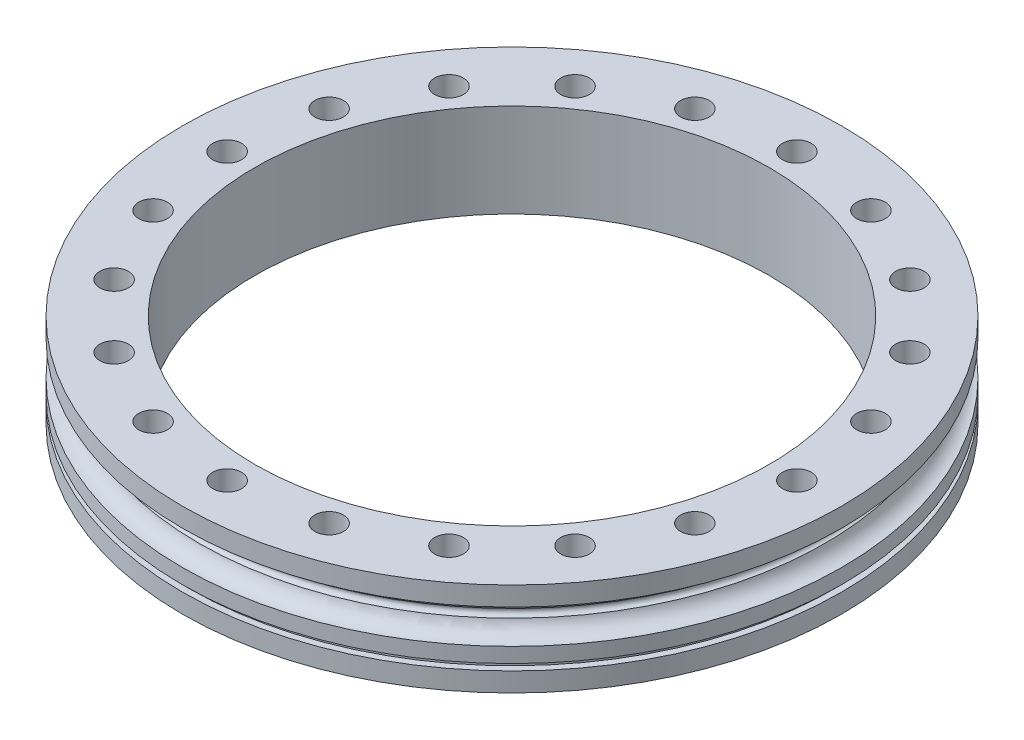
ISO-10303-21;
HEADER;
FILE_DESCRIPTION(('STEP AP214'),'2;1');
FILE_NAME('part.step','',(''),(''),'','','');
FILE_SCHEMA(('AUTOMOTIVE_DESIGN { 1 0 10303 214 1 1 1 1 }'));
ENDSEC;
DATA;
#1=APPLICATION_CONTEXT('core data for automotive mechanical design processes');
#2=APPLICATION_PROTOCOL_DEFINITION('international standard','automotive_design',2000,#1);
#3=PRODUCT_CONTEXT('',#1,'mechanical');
#4=PRODUCT('Part','Part','',(#3));
#5=PRODUCT_RELATED_PRODUCT_CATEGORY('part','',(#4));
#6=PRODUCT_DEFINITION_FORMATION('','',#4);
#7=PRODUCT_DEFINITION_CONTEXT('part definition',#1,'design');
#8=PRODUCT_DEFINITION('design','',#6,#7);
#9=PRODUCT_DEFINITION_SHAPE('','',#8);
#10=(LENGTH_UNIT() NAMED_UNIT(*) SI_UNIT(.MILLI.,.METRE.));
#11=(NAMED_UNIT(*) PLANE_ANGLE_UNIT() SI_UNIT($,.RADIAN.));
#12=(NAMED_UNIT(*) SI_UNIT($,.STERADIAN.) SOLID_ANGLE_UNIT());
#13=UNCERTAINTY_MEASURE_WITH_UNIT(LENGTH_MEASURE(1.E-05),#10,'distance_accuracy_value','');
#14=(GEOMETRIC_REPRESENTATION_CONTEXT(3) GLOBAL_UNCERTAINTY_ASSIGNED_CONTEXT((#13)) GLOBAL_UNIT_ASSIGNED_CONTEXT((#10,
#11,#12)) REPRESENTATION_CONTEXT('',''));
#15=CARTESIAN_POINT('',(0.,0.,0.));
#16=DIRECTION('',(0.,0.,1.));
#17=DIRECTION('',(1.,0.,0.));
#18=AXIS2_PLACEMENT_3D('',#15,#16,#17);
#19=CARTESIAN_POINT('',(0.,15.,0.));
#20=DIRECTION('',(0.,1.,0.));
#21=DIRECTION('',(0.,0.,1.));
#22=AXIS2_PLACEMENT_3D('',#19,#20,#21);
#23=TOROIDAL_SURFACE('',#22,155.,8.00000000000001);
#24=CARTESIAN_POINT('',(0.,16.9843134832984,0.));
#25=DIRECTION('',(0.,1.,0.));
#26=DIRECTION('',(0.,0.,1.));
#27=AXIS2_PLACEMENT_3D('',#24,#25,#26);
#28=CIRCLE('',#27,147.25);
#29=CARTESIAN_POINT('',(0.,16.9843134832984,147.25));
#30=VERTEX_POINT('',#29);
#31=EDGE_CURVE('E71',#30,#30,#28,.T.);
#32=ORIENTED_EDGE('',*,*,#31,.T.);
#33=EDGE_LOOP('',(#32));
#34=FACE_BOUND('',#33,.T.);
#35=CARTESIAN_POINT('',(0.,23.,0.));
#36=DIRECTION('',(0.,1.,0.));
#37=DIRECTION('',(0.,0.,1.));
#38=AXIS2_PLACEMENT_3D('',#35,#36,#37);
#39=CIRCLE('',#38,155.);
#40=CARTESIAN_POINT('',(0.,23.,155.));
#41=VERTEX_POINT('',#40);
#42=EDGE_CURVE('E10',#41,#41,#39,.T.);
#43=ORIENTED_EDGE('',*,*,#42,.F.);
#44=EDGE_LOOP('',(#43));
#45=FACE_BOUND('',#44,.T.);
#46=ADVANCED_FACE('F31',(#34,#45),#23,.F.);
#47=CARTESIAN_POINT('',(0.,44.,0.));
#48=DIRECTION('',(0.,1.,0.));
#49=DIRECTION('',(0.,0.,1.));
#50=AXIS2_PLACEMENT_3D('',#47,#48,#49);
#51=CYLINDRICAL_SURFACE('',#50,155.);
#52=ORIENTED_EDGE('',*,*,#42,.T.);
#53=EDGE_LOOP('',(#52));
#54=FACE_BOUND('',#53,.T.);
#55=CARTESIAN_POINT('',(0.,32.,0.));
#56=DIRECTION('',(0.,1.,0.));
#57=DIRECTION('',(0.,0.,1.));
#58=AXIS2_PLACEMENT_3D('',#55,#56,#57);
#59=CIRCLE('',#58,155.);
#60=CARTESIAN_POINT('',(0.,32.,155.));
#61=VERTEX_POINT('',#60);
#62=EDGE_CURVE('E37',#61,#61,#59,.T.);
#63=ORIENTED_EDGE('',*,*,#62,.F.);
#64=EDGE_LOOP('',(#63));
#65=FACE_BOUND('',#64,.T.);
#66=ADVANCED_FACE('F209',(#54,#65),#51,.T.);
#67=CARTESIAN_POINT('',(-155.,32.,0.));
#68=DIRECTION('',(0.,1.,0.));
#69=DIRECTION('',(0.,0.,1.));
#70=AXIS2_PLACEMENT_3D('',#67,#68,#69);
#71=PLANE('',#70);
#72=CARTESIAN_POINT('',(-127.441573183551,32.,41.408277246243));
#73=DIRECTION('',(0.,1.,0.));
#74=DIRECTION('',(0.,0.,1.));
#75=AXIS2_PLACEMENT_3D('',#72,#73,#74);
#76=CIRCLE('',#75,6.75000000000053);
#77=CARTESIAN_POINT('',(-127.441573183551,32.,48.1582772462435));
#78=VERTEX_POINT('',#77);
#79=EDGE_CURVE('E189',#78,#78,#76,.T.);
#80=ORIENTED_EDGE('',*,*,#79,.F.);
#81=EDGE_LOOP('',(#80));
#82=FACE_BOUND('',#81,.T.);
#83=CARTESIAN_POINT('',(-108.408277246244,32.,78.76322380719));
#84=DIRECTION('',(0.,1.,0.));
#85=DIRECTION('',(0.,0.,1.));
#86=AXIS2_PLACEMENT_3D('',#83,#84,#85);
#87=CIRCLE('',#86,6.75);
#88=CARTESIAN_POINT('',(-108.408277246244,32.,85.51322380719));
#89=VERTEX_POINT('',#88);
#90=EDGE_CURVE('E183',#89,#89,#87,.T.);
#91=ORIENTED_EDGE('',*,*,#90,.F.);
#92=EDGE_LOOP('',(#91));
#93=FACE_BOUND('',#92,.T.);
#94=CARTESIAN_POINT('',(-78.7632238071927,32.,108.408277246242));
#95=DIRECTION('',(0.,1.,0.));
#96=DIRECTION('',(0.,0.,1.));
#97=AXIS2_PLACEMENT_3D('',#94,#95,#96);
#98=CIRCLE('',#97,6.74999999999999);
#99=CARTESIAN_POINT('',(-78.7632238071927,32.,115.158277246242));
#100=VERTEX_POINT('',#99);
#101=EDGE_CURVE('E177',#100,#100,#98,.T.);
#102=ORIENTED_EDGE('',*,*,#101,.F.);
#103=EDGE_LOOP('',(#102));
#104=FACE_BOUND('',#103,.T.);
#105=CARTESIAN_POINT('',(-41.4082772462444,32.,127.44157318355));
#106=DIRECTION('',(0.,1.,0.));
#107=DIRECTION('',(0.,0.,1.));
#108=AXIS2_PLACEMENT_3D('',#105,#106,#107);
#109=CIRCLE('',#108,6.75);
#110=CARTESIAN_POINT('',(-41.4082772462444,32.,134.19157318355));
#111=VERTEX_POINT('',#110);
#112=EDGE_CURVE('E171',#111,#111,#109,.T.);
#113=ORIENTED_EDGE('',*,*,#112,.F.);
#114=EDGE_LOOP('',(#113));
#115=FACE_BOUND('',#114,.T.);
#116=CARTESIAN_POINT('',(-1.38716523110637E-12,32.,134.));
#117=DIRECTION('',(0.,1.,0.));
#118=DIRECTION('',(0.,0.,1.));
#119=AXIS2_PLACEMENT_3D('',#116,#117,#118);
#120=CIRCLE('',#119,6.75000000000001);
#121=CARTESIAN_POINT('',(-1.38716523110637E-12,32.,140.75));
#122=VERTEX_POINT('',#121);
#123=EDGE_CURVE('E165',#122,#122,#120,.T.);
#124=ORIENTED_EDGE('',*,*,#123,.F.);
#125=EDGE_LOOP('',(#124));
#126=FACE_BOUND('',#125,.T.);
#127=CARTESIAN_POINT('',(41.4082772462417,32.,127.441573183551));
#128=DIRECTION('',(0.,1.,0.));
#129=DIRECTION('',(0.,0.,1.));
#130=AXIS2_PLACEMENT_3D('',#127,#128,#129);
#131=CIRCLE('',#130,6.75000000000001);
#132=CARTESIAN_POINT('',(41.4082772462417,32.,134.191573183551));
#133=VERTEX_POINT('',#132);
#134=EDGE_CURVE('E159',#133,#133,#131,.T.);
#135=ORIENTED_EDGE('',*,*,#134,.F.);
#136=EDGE_LOOP('',(#135));
#137=FACE_BOUND('',#136,.T.);
#138=CARTESIAN_POINT('',(78.7632238071904,32.,108.408277246244));
#139=DIRECTION('',(0.,1.,0.));
#140=DIRECTION('',(0.,0.,1.));
#141=AXIS2_PLACEMENT_3D('',#138,#139,#140);
#142=CIRCLE('',#141,6.75);
#143=CARTESIAN_POINT('',(78.7632238071904,32.,115.158277246244));
#144=VERTEX_POINT('',#143);
#145=EDGE_CURVE('E153',#144,#144,#142,.T.);
#146=ORIENTED_EDGE('',*,*,#145,.F.);
#147=EDGE_LOOP('',(#146));
#148=FACE_BOUND('',#147,.T.);
#149=CARTESIAN_POINT('',(108.408277246242,32.,78.7632238071924));
#150=DIRECTION('',(0.,1.,0.));
#151=DIRECTION('',(0.,0.,1.));
#152=AXIS2_PLACEMENT_3D('',#149,#150,#151);
#153=CIRCLE('',#152,6.75);
#154=CARTESIAN_POINT('',(108.408277246242,32.,85.5132238071924));
#155=VERTEX_POINT('',#154);
#156=EDGE_CURVE('E147',#155,#155,#153,.T.);
#157=ORIENTED_EDGE('',*,*,#156,.F.);
#158=EDGE_LOOP('',(#157));
#159=FACE_BOUND('',#158,.T.);
#160=CARTESIAN_POINT('',(127.44157318355,32.,41.408277246244));
#161=DIRECTION('',(0.,1.,0.));
#162=DIRECTION('',(0.,0.,1.));
#163=AXIS2_PLACEMENT_3D('',#160,#161,#162);
#164=CIRCLE('',#163,6.74999999999999);
#165=CARTESIAN_POINT('',(127.44157318355,32.,48.1582772462439));
#166=VERTEX_POINT('',#165);
#167=EDGE_CURVE('E141',#166,#166,#164,.T.);
#168=ORIENTED_EDGE('',*,*,#167,.F.);
#169=EDGE_LOOP('',(#168));
#170=FACE_BOUND('',#169,.T.);
#171=CARTESIAN_POINT('',(134.,32.,9.19306731701385E-13));
#172=DIRECTION('',(0.,1.,0.));
#173=DIRECTION('',(0.,0.,1.));
#174=AXIS2_PLACEMENT_3D('',#171,#172,#173);
#175=CIRCLE('',#174,6.74999999999999);
#176=CARTESIAN_POINT('',(134.,32.,6.75000000000091));
#177=VERTEX_POINT('',#176);
#178=EDGE_CURVE('E135',#177,#177,#175,.T.);
#179=ORIENTED_EDGE('',*,*,#178,.F.);
#180=EDGE_LOOP('',(#179));
#181=FACE_BOUND('',#180,.T.);
#182=CARTESIAN_POINT('',(127.441573183551,32.,-41.4082772462421));
#183=DIRECTION('',(0.,1.,0.));
#184=DIRECTION('',(0.,0.,1.));
#185=AXIS2_PLACEMENT_3D('',#182,#183,#184);
#186=CIRCLE('',#185,6.75);
#187=CARTESIAN_POINT('',(127.441573183551,32.,-34.6582772462421));
#188=VERTEX_POINT('',#187);
#189=EDGE_CURVE('E129',#188,#188,#186,.T.);
#190=ORIENTED_EDGE('',*,*,#189,.F.);
#191=EDGE_LOOP('',(#190));
#192=FACE_BOUND('',#191,.T.);
#193=CARTESIAN_POINT('',(108.408277246243,32.,-78.7632238071908));
#194=DIRECTION('',(0.,1.,0.));
#195=DIRECTION('',(0.,0.,1.));
#196=AXIS2_PLACEMENT_3D('',#193,#194,#195);
#197=CIRCLE('',#196,6.75);
#198=CARTESIAN_POINT('',(108.408277246243,32.,-72.0132238071908));
#199=VERTEX_POINT('',#198);
#200=EDGE_CURVE('E123',#199,#199,#197,.T.);
#201=ORIENTED_EDGE('',*,*,#200,.F.);
#202=EDGE_LOOP('',(#201));
#203=FACE_BOUND('',#202,.T.);
#204=CARTESIAN_POINT('',(78.7632238071919,32.,-108.408277246243));
#205=DIRECTION('',(0.,1.,0.));
#206=DIRECTION('',(0.,0.,1.));
#207=AXIS2_PLACEMENT_3D('',#204,#205,#206);
#208=CIRCLE('',#207,6.75000000000002);
#209=CARTESIAN_POINT('',(78.7632238071919,32.,-101.658277246243));
#210=VERTEX_POINT('',#209);
#211=EDGE_CURVE('E117',#210,#210,#208,.T.);
#212=ORIENTED_EDGE('',*,*,#211,.F.);
#213=EDGE_LOOP('',(#212));
#214=FACE_BOUND('',#213,.T.);
#215=CARTESIAN_POINT('',(41.4082772462435,32.,-127.44157318355));
#216=DIRECTION('',(0.,1.,0.));
#217=DIRECTION('',(0.,0.,1.));
#218=AXIS2_PLACEMENT_3D('',#215,#216,#217);
#219=CIRCLE('',#218,6.74999999999999);
#220=CARTESIAN_POINT('',(41.4082772462435,32.,-120.69157318355));
#221=VERTEX_POINT('',#220);
#222=EDGE_CURVE('E111',#221,#221,#219,.T.);
#223=ORIENTED_EDGE('',*,*,#222,.F.);
#224=EDGE_LOOP('',(#223));
#225=FACE_BOUND('',#224,.T.);
#226=CARTESIAN_POINT('',(4.51448232296405E-13,32.,-134.));
#227=DIRECTION('',(0.,1.,0.));
#228=DIRECTION('',(0.,0.,1.));
#229=AXIS2_PLACEMENT_3D('',#226,#227,#228);
#230=CIRCLE('',#229,6.74999999999999);
#231=CARTESIAN_POINT('',(4.51448232296405E-13,32.,-127.25));
#232=VERTEX_POINT('',#231);
#233=EDGE_CURVE('E105',#232,#232,#230,.T.);
#234=ORIENTED_EDGE('',*,*,#233,.F.);
#235=EDGE_LOOP('',(#234));
#236=FACE_BOUND('',#235,.T.);
#237=CARTESIAN_POINT('',(-41.4082772462426,32.,-127.441573183551));
#238=DIRECTION('',(0.,1.,0.));
#239=DIRECTION('',(0.,0.,1.));
#240=AXIS2_PLACEMENT_3D('',#237,#238,#239);
#241=CIRCLE('',#240,6.75000000000003);
#242=CARTESIAN_POINT('',(-41.4082772462426,32.,-120.691573183551));
#243=VERTEX_POINT('',#242);
#244=EDGE_CURVE('E99',#243,#243,#241,.T.);
#245=ORIENTED_EDGE('',*,*,#244,.F.);
#246=EDGE_LOOP('',(#245));
#247=FACE_BOUND('',#246,.T.);
#248=CARTESIAN_POINT('',(-78.7632238071912,32.,-108.408277246243));
#249=DIRECTION('',(0.,1.,0.));
#250=DIRECTION('',(0.,0.,1.));
#251=AXIS2_PLACEMENT_3D('',#248,#249,#250);
#252=CIRCLE('',#251,6.75);
#253=CARTESIAN_POINT('',(-78.7632238071912,32.,-101.658277246243));
#254=VERTEX_POINT('',#253);
#255=EDGE_CURVE('E93',#254,#254,#252,.T.);
#256=ORIENTED_EDGE('',*,*,#255,.F.);
#257=EDGE_LOOP('',(#256));
#258=FACE_BOUND('',#257,.T.);
#259=CARTESIAN_POINT('',(-108.408277246243,32.,-78.7632238071915));
#260=DIRECTION('',(0.,1.,0.));
#261=DIRECTION('',(0.,0.,1.));
#262=AXIS2_PLACEMENT_3D('',#259,#260,#261);
#263=CIRCLE('',#262,6.75);
#264=CARTESIAN_POINT('',(-108.408277246243,32.,-72.0132238071916));
#265=VERTEX_POINT('',#264);
#266=EDGE_CURVE('E87',#265,#265,#263,.T.);
#267=ORIENTED_EDGE('',*,*,#266,.F.);
#268=EDGE_LOOP('',(#267));
#269=FACE_BOUND('',#268,.T.);
#270=CARTESIAN_POINT('',(-127.441573183551,32.,-41.4082772462429));
#271=DIRECTION('',(0.,1.,0.));
#272=DIRECTION('',(0.,0.,1.));
#273=AXIS2_PLACEMENT_3D('',#270,#271,#272);
#274=CIRCLE('',#273,6.75000000000001);
#275=CARTESIAN_POINT('',(-127.441573183551,32.,-34.6582772462429));
#276=VERTEX_POINT('',#275);
#277=EDGE_CURVE('E81',#276,#276,#274,.T.);
#278=ORIENTED_EDGE('',*,*,#277,.F.);
#279=EDGE_LOOP('',(#278));
#280=FACE_BOUND('',#279,.T.);
#281=CARTESIAN_POINT('',(-134.,32.,0.));
#282=DIRECTION('',(0.,1.,0.));
#283=DIRECTION('',(0.,0.,1.));
#284=AXIS2_PLACEMENT_3D('',#281,#282,#283);
#285=CIRCLE('',#284,6.75);
#286=CARTESIAN_POINT('',(-134.,32.,6.75000000000002));
#287=VERTEX_POINT('',#286);
#288=EDGE_CURVE('E75',#287,#287,#285,.T.);
#289=ORIENTED_EDGE('',*,*,#288,.F.);
#290=EDGE_LOOP('',(#289));
#291=FACE_BOUND('',#290,.T.);
#292=ORIENTED_EDGE('',*,*,#62,.T.);
#293=EDGE_LOOP('',(#292));
#294=FACE_BOUND('',#293,.T.);
#295=CARTESIAN_POINT('',(0.,32.,0.));
#296=DIRECTION('',(0.,1.,0.));
#297=DIRECTION('',(0.,0.,1.));
#298=AXIS2_PLACEMENT_3D('',#295,#296,#297);
#299=CIRCLE('',#298,121.);
#300=CARTESIAN_POINT('',(0.,32.,121.));
#301=VERTEX_POINT('',#300);
#302=EDGE_CURVE('E41',#301,#301,#299,.T.);
#303=ORIENTED_EDGE('',*,*,#302,.F.);
#304=EDGE_LOOP('',(#303));
#305=FACE_BOUND('',#304,.T.);
#306=ADVANCED_FACE('F205',(#82,#93,#104,#115,#126,#137,#148,#159,#170,#181,#192,#203,#214,#225,
#236,#247,#258,#269,#280,#291,#294,#305),#71,.T.);
#307=CARTESIAN_POINT('',(0.,44.,0.));
#308=DIRECTION('',(0.,1.,0.));
#309=DIRECTION('',(0.,0.,1.));
#310=AXIS2_PLACEMENT_3D('',#307,#308,#309);
#311=CYLINDRICAL_SURFACE('',#310,121.);
#312=ORIENTED_EDGE('',*,*,#302,.T.);
#313=EDGE_LOOP('',(#312));
#314=FACE_BOUND('',#313,.T.);
#315=CARTESIAN_POINT('',(0.,-12.,0.));
#316=DIRECTION('',(0.,1.,0.));
#317=DIRECTION('',(0.,0.,1.));
#318=AXIS2_PLACEMENT_3D('',#315,#316,#317);
#319=CIRCLE('',#318,121.);
#320=CARTESIAN_POINT('',(0.,-12.,121.));
#321=VERTEX_POINT('',#320);
#322=EDGE_CURVE('E45',#321,#321,#319,.T.);
#323=ORIENTED_EDGE('',*,*,#322,.F.);
#324=EDGE_LOOP('',(#323));
#325=FACE_BOUND('',#324,.T.);
#326=ADVANCED_FACE('F208',(#314,#325),#311,.F.);
#327=CARTESIAN_POINT('',(-121.,-12.,0.));
#328=DIRECTION('',(0.,-1.,0.));
#329=DIRECTION('',(0.,0.,-1.));
#330=AXIS2_PLACEMENT_3D('',#327,#328,#329);
#331=PLANE('',#330);
#332=CARTESIAN_POINT('',(-127.441573183551,-12.,41.408277246243));
#333=DIRECTION('',(0.,1.,0.));
#334=DIRECTION('',(0.,0.,1.));
#335=AXIS2_PLACEMENT_3D('',#332,#333,#334);
#336=CIRCLE('',#335,6.75000000000053);
#337=CARTESIAN_POINT('',(-127.441573183551,-12.,48.1582772462435));
#338=VERTEX_POINT('',#337);
#339=EDGE_CURVE('E186',#338,#338,#336,.T.);
#340=ORIENTED_EDGE('',*,*,#339,.T.);
#341=EDGE_LOOP('',(#340));
#342=FACE_BOUND('',#341,.T.);
#343=CARTESIAN_POINT('',(-108.408277246244,-12.,78.76322380719));
#344=DIRECTION('',(0.,1.,0.));
#345=DIRECTION('',(0.,0.,1.));
#346=AXIS2_PLACEMENT_3D('',#343,#344,#345);
#347=CIRCLE('',#346,6.75);
#348=CARTESIAN_POINT('',(-108.408277246244,-12.,85.51322380719));
#349=VERTEX_POINT('',#348);
#350=EDGE_CURVE('E180',#349,#349,#347,.T.);
#351=ORIENTED_EDGE('',*,*,#350,.T.);
#352=EDGE_LOOP('',(#351));
#353=FACE_BOUND('',#352,.T.);
#354=CARTESIAN_POINT('',(-78.7632238071927,-12.,108.408277246242));
#355=DIRECTION('',(0.,1.,0.));
#356=DIRECTION('',(0.,0.,1.));
#357=AXIS2_PLACEMENT_3D('',#354,#355,#356);
#358=CIRCLE('',#357,6.74999999999999);
#359=CARTESIAN_POINT('',(-78.7632238071927,-12.,115.158277246242));
#360=VERTEX_POINT('',#359);
#361=EDGE_CURVE('E174',#360,#360,#358,.T.);
#362=ORIENTED_EDGE('',*,*,#361,.T.);
#363=EDGE_LOOP('',(#362));
#364=FACE_BOUND('',#363,.T.);
#365=CARTESIAN_POINT('',(-41.4082772462444,-12.,127.44157318355));
#366=DIRECTION('',(0.,1.,0.));
#367=DIRECTION('',(0.,0.,1.));
#368=AXIS2_PLACEMENT_3D('',#365,#366,#367);
#369=CIRCLE('',#368,6.75);
#370=CARTESIAN_POINT('',(-41.4082772462444,-12.,134.19157318355));
#371=VERTEX_POINT('',#370);
#372=EDGE_CURVE('E168',#371,#371,#369,.T.);
#373=ORIENTED_EDGE('',*,*,#372,.T.);
#374=EDGE_LOOP('',(#373));
#375=FACE_BOUND('',#374,.T.);
#376=CARTESIAN_POINT('',(-1.38716523110637E-12,-12.,134.));
#377=DIRECTION('',(0.,1.,0.));
#378=DIRECTION('',(0.,0.,1.));
#379=AXIS2_PLACEMENT_3D('',#376,#377,#378);
#380=CIRCLE('',#379,6.75000000000001);
#381=CARTESIAN_POINT('',(-1.38716523110637E-12,-12.,140.75));
#382=VERTEX_POINT('',#381);
#383=EDGE_CURVE('E162',#382,#382,#380,.T.);
#384=ORIENTED_EDGE('',*,*,#383,.T.);
#385=EDGE_LOOP('',(#384));
#386=FACE_BOUND('',#385,.T.);
#387=CARTESIAN_POINT('',(41.4082772462417,-12.,127.441573183551));
#388=DIRECTION('',(0.,1.,0.));
#389=DIRECTION('',(0.,0.,1.));
#390=AXIS2_PLACEMENT_3D('',#387,#388,#389);
#391=CIRCLE('',#390,6.75000000000001);
#392=CARTESIAN_POINT('',(41.4082772462417,-12.,134.191573183551));
#393=VERTEX_POINT('',#392);
#394=EDGE_CURVE('E156',#393,#393,#391,.T.);
#395=ORIENTED_EDGE('',*,*,#394,.T.);
#396=EDGE_LOOP('',(#395));
#397=FACE_BOUND('',#396,.T.);
#398=CARTESIAN_POINT('',(78.7632238071904,-12.,108.408277246244));
#399=DIRECTION('',(0.,1.,0.));
#400=DIRECTION('',(0.,0.,1.));
#401=AXIS2_PLACEMENT_3D('',#398,#399,#400);
#402=CIRCLE('',#401,6.75);
#403=CARTESIAN_POINT('',(78.7632238071904,-12.,115.158277246244));
#404=VERTEX_POINT('',#403);
#405=EDGE_CURVE('E150',#404,#404,#402,.T.);
#406=ORIENTED_EDGE('',*,*,#405,.T.);
#407=EDGE_LOOP('',(#406));
#408=FACE_BOUND('',#407,.T.);
#409=CARTESIAN_POINT('',(108.408277246242,-12.,78.7632238071924));
#410=DIRECTION('',(0.,1.,0.));
#411=DIRECTION('',(0.,0.,1.));
#412=AXIS2_PLACEMENT_3D('',#409,#410,#411);
#413=CIRCLE('',#412,6.75);
#414=CARTESIAN_POINT('',(108.408277246242,-12.,85.5132238071924));
#415=VERTEX_POINT('',#414);
#416=EDGE_CURVE('E144',#415,#415,#413,.T.);
#417=ORIENTED_EDGE('',*,*,#416,.T.);
#418=EDGE_LOOP('',(#417));
#419=FACE_BOUND('',#418,.T.);
#420=CARTESIAN_POINT('',(127.44157318355,-12.,41.408277246244));
#421=DIRECTION('',(0.,1.,0.));
#422=DIRECTION('',(0.,0.,1.));
#423=AXIS2_PLACEMENT_3D('',#420,#421,#422);
#424=CIRCLE('',#423,6.74999999999999);
#425=CARTESIAN_POINT('',(127.44157318355,-12.,48.1582772462439));
#426=VERTEX_POINT('',#425);
#427=EDGE_CURVE('E138',#426,#426,#424,.T.);
#428=ORIENTED_EDGE('',*,*,#427,.T.);
#429=EDGE_LOOP('',(#428));
#430=FACE_BOUND('',#429,.T.);
#431=CARTESIAN_POINT('',(134.,-12.,9.19306731701385E-13));
#432=DIRECTION('',(0.,1.,0.));
#433=DIRECTION('',(0.,0.,1.));
#434=AXIS2_PLACEMENT_3D('',#431,#432,#433);
#435=CIRCLE('',#434,6.74999999999999);
#436=CARTESIAN_POINT('',(134.,-12.,6.75000000000091));
#437=VERTEX_POINT('',#436);
#438=EDGE_CURVE('E132',#437,#437,#435,.T.);
#439=ORIENTED_EDGE('',*,*,#438,.T.);
#440=EDGE_LOOP('',(#439));
#441=FACE_BOUND('',#440,.T.);
#442=CARTESIAN_POINT('',(127.441573183551,-12.,-41.4082772462421));
#443=DIRECTION('',(0.,1.,0.));
#444=DIRECTION('',(0.,0.,1.));
#445=AXIS2_PLACEMENT_3D('',#442,#443,#444);
#446=CIRCLE('',#445,6.75);
#447=CARTESIAN_POINT('',(127.441573183551,-12.,-34.6582772462421));
#448=VERTEX_POINT('',#447);
#449=EDGE_CURVE('E126',#448,#448,#446,.T.);
#450=ORIENTED_EDGE('',*,*,#449,.T.);
#451=EDGE_LOOP('',(#450));
#452=FACE_BOUND('',#451,.T.);
#453=CARTESIAN_POINT('',(108.408277246243,-12.,-78.7632238071908));
#454=DIRECTION('',(0.,1.,0.));
#455=DIRECTION('',(0.,0.,1.));
#456=AXIS2_PLACEMENT_3D('',#453,#454,#455);
#457=CIRCLE('',#456,6.75);
#458=CARTESIAN_POINT('',(108.408277246243,-12.,-72.0132238071908));
#459=VERTEX_POINT('',#458);
#460=EDGE_CURVE('E120',#459,#459,#457,.T.);
#461=ORIENTED_EDGE('',*,*,#460,.T.);
#462=EDGE_LOOP('',(#461));
#463=FACE_BOUND('',#462,.T.);
#464=CARTESIAN_POINT('',(78.7632238071919,-12.,-108.408277246243));
#465=DIRECTION('',(0.,1.,0.));
#466=DIRECTION('',(0.,0.,1.));
#467=AXIS2_PLACEMENT_3D('',#464,#465,#466);
#468=CIRCLE('',#467,6.75000000000002);
#469=CARTESIAN_POINT('',(78.7632238071919,-12.,-101.658277246243));
#470=VERTEX_POINT('',#469);
#471=EDGE_CURVE('E114',#470,#470,#468,.T.);
#472=ORIENTED_EDGE('',*,*,#471,.T.);
#473=EDGE_LOOP('',(#472));
#474=FACE_BOUND('',#473,.T.);
#475=CARTESIAN_POINT('',(41.4082772462435,-12.,-127.44157318355));
#476=DIRECTION('',(0.,1.,0.));
#477=DIRECTION('',(0.,0.,1.));
#478=AXIS2_PLACEMENT_3D('',#475,#476,#477);
#479=CIRCLE('',#478,6.74999999999999);
#480=CARTESIAN_POINT('',(41.4082772462435,-12.,-120.69157318355));
#481=VERTEX_POINT('',#480);
#482=EDGE_CURVE('E108',#481,#481,#479,.T.);
#483=ORIENTED_EDGE('',*,*,#482,.T.);
#484=EDGE_LOOP('',(#483));
#485=FACE_BOUND('',#484,.T.);
#486=CARTESIAN_POINT('',(4.51448232296405E-13,-12.,-134.));
#487=DIRECTION('',(0.,1.,0.));
#488=DIRECTION('',(0.,0.,1.));
#489=AXIS2_PLACEMENT_3D('',#486,#487,#488);
#490=CIRCLE('',#489,6.74999999999999);
#491=CARTESIAN_POINT('',(4.51448232296405E-13,-12.,-127.25));
#492=VERTEX_POINT('',#491);
#493=EDGE_CURVE('E102',#492,#492,#490,.T.);
#494=ORIENTED_EDGE('',*,*,#493,.T.);
#495=EDGE_LOOP('',(#494));
#496=FACE_BOUND('',#495,.T.);
#497=CARTESIAN_POINT('',(-41.4082772462426,-12.,-127.441573183551));
#498=DIRECTION('',(0.,1.,0.));
#499=DIRECTION('',(0.,0.,1.));
#500=AXIS2_PLACEMENT_3D('',#497,#498,#499);
#501=CIRCLE('',#500,6.75000000000003);
#502=CARTESIAN_POINT('',(-41.4082772462426,-12.,-120.691573183551));
#503=VERTEX_POINT('',#502);
#504=EDGE_CURVE('E96',#503,#503,#501,.T.);
#505=ORIENTED_EDGE('',*,*,#504,.T.);
#506=EDGE_LOOP('',(#505));
#507=FACE_BOUND('',#506,.T.);
#508=CARTESIAN_POINT('',(-78.7632238071912,-12.,-108.408277246243));
#509=DIRECTION('',(0.,1.,0.));
#510=DIRECTION('',(0.,0.,1.));
#511=AXIS2_PLACEMENT_3D('',#508,#509,#510);
#512=CIRCLE('',#511,6.75);
#513=CARTESIAN_POINT('',(-78.7632238071912,-12.,-101.658277246243));
#514=VERTEX_POINT('',#513);
#515=EDGE_CURVE('E90',#514,#514,#512,.T.);
#516=ORIENTED_EDGE('',*,*,#515,.T.);
#517=EDGE_LOOP('',(#516));
#518=FACE_BOUND('',#517,.T.);
#519=CARTESIAN_POINT('',(-108.408277246243,-12.,-78.7632238071915));
#520=DIRECTION('',(0.,1.,0.));
#521=DIRECTION('',(0.,0.,1.));
#522=AXIS2_PLACEMENT_3D('',#519,#520,#521);
#523=CIRCLE('',#522,6.75);
#524=CARTESIAN_POINT('',(-108.408277246243,-12.,-72.0132238071916));
#525=VERTEX_POINT('',#524);
#526=EDGE_CURVE('E84',#525,#525,#523,.T.);
#527=ORIENTED_EDGE('',*,*,#526,.T.);
#528=EDGE_LOOP('',(#527));
#529=FACE_BOUND('',#528,.T.);
#530=CARTESIAN_POINT('',(-127.441573183551,-12.,-41.4082772462429));
#531=DIRECTION('',(0.,1.,0.));
#532=DIRECTION('',(0.,0.,1.));
#533=AXIS2_PLACEMENT_3D('',#530,#531,#532);
#534=CIRCLE('',#533,6.75000000000001);
#535=CARTESIAN_POINT('',(-127.441573183551,-12.,-34.6582772462429));
#536=VERTEX_POINT('',#535);
#537=EDGE_CURVE('E78',#536,#536,#534,.T.);
#538=ORIENTED_EDGE('',*,*,#537,.T.);
#539=EDGE_LOOP('',(#538));
#540=FACE_BOUND('',#539,.T.);
#541=CARTESIAN_POINT('',(-134.,-12.,0.));
#542=DIRECTION('',(0.,1.,0.));
#543=DIRECTION('',(0.,0.,1.));
#544=AXIS2_PLACEMENT_3D('',#541,#542,#543);
#545=CIRCLE('',#544,6.75);
#546=CARTESIAN_POINT('',(-134.,-12.,6.75000000000002));
#547=VERTEX_POINT('',#546);
#548=EDGE_CURVE('E74',#547,#547,#545,.T.);
#549=ORIENTED_EDGE('',*,*,#548,.T.);
#550=EDGE_LOOP('',(#549));
#551=FACE_BOUND('',#550,.T.);
#552=ORIENTED_EDGE('',*,*,#322,.T.);
#553=EDGE_LOOP('',(#552));
#554=FACE_BOUND('',#553,.T.);
#555=CARTESIAN_POINT('',(0.,-12.,0.));
#556=DIRECTION('',(0.,1.,0.));
#557=DIRECTION('',(0.,0.,1.));
#558=AXIS2_PLACEMENT_3D('',#555,#556,#557);
#559=CIRCLE('',#558,155.);
#560=CARTESIAN_POINT('',(0.,-12.,155.));
#561=VERTEX_POINT('',#560);
#562=EDGE_CURVE('E50',#561,#561,#559,.T.);
#563=ORIENTED_EDGE('',*,*,#562,.F.);
#564=EDGE_LOOP('',(#563));
#565=FACE_BOUND('',#564,.T.);
#566=ADVANCED_FACE('F195',(#342,#353,#364,#375,#386,#397,#408,#419,#430,#441,#452,#463,#474,
#485,#496,#507,#518,#529,#540,#551,#554,#565),#331,.T.);
#567=CARTESIAN_POINT('',(0.,44.,0.));
#568=DIRECTION('',(0.,1.,0.));
#569=DIRECTION('',(0.,0.,1.));
#570=AXIS2_PLACEMENT_3D('',#567,#568,#569);
#571=CYLINDRICAL_SURFACE('',#570,155.);
#572=ORIENTED_EDGE('',*,*,#562,.T.);
#573=EDGE_LOOP('',(#572));
#574=FACE_BOUND('',#573,.T.);
#575=CARTESIAN_POINT('',(0.,-3.00000000000002,0.));
#576=DIRECTION('',(0.,1.,0.));
#577=DIRECTION('',(0.,0.,1.));
#578=AXIS2_PLACEMENT_3D('',#575,#576,#577);
#579=CIRCLE('',#578,155.);
#580=CARTESIAN_POINT('',(0.,-3.00000000000002,155.));
#581=VERTEX_POINT('',#580);
#582=EDGE_CURVE('E53',#581,#581,#579,.T.);
#583=ORIENTED_EDGE('',*,*,#582,.F.);
#584=EDGE_LOOP('',(#583));
#585=FACE_BOUND('',#584,.T.);
#586=ADVANCED_FACE('F258',(#574,#585),#571,.T.);
#587=CARTESIAN_POINT('',(-152.,-3.00000000000002,0.));
#588=DIRECTION('',(0.,1.,0.));
#589=DIRECTION('',(0.,0.,1.));
#590=AXIS2_PLACEMENT_3D('',#587,#588,#589);
#591=PLANE('',#590);
#592=ORIENTED_EDGE('',*,*,#582,.T.);
#593=EDGE_LOOP('',(#592));
#594=FACE_BOUND('',#593,.T.);
#595=CARTESIAN_POINT('',(0.,-3.00000000000002,0.));
#596=DIRECTION('',(0.,1.,0.));
#597=DIRECTION('',(0.,0.,1.));
#598=AXIS2_PLACEMENT_3D('',#595,#596,#597);
#599=CIRCLE('',#598,152.);
#600=CARTESIAN_POINT('',(0.,-3.00000000000002,152.));
#601=VERTEX_POINT('',#600);
#602=EDGE_CURVE('E56',#601,#601,#599,.T.);
#603=ORIENTED_EDGE('',*,*,#602,.F.);
#604=EDGE_LOOP('',(#603));
#605=FACE_BOUND('',#604,.T.);
#606=ADVANCED_FACE('F264',(#594,#605),#591,.T.);
#607=CARTESIAN_POINT('',(0.,44.,0.));
#608=DIRECTION('',(0.,1.,0.));
#609=DIRECTION('',(0.,0.,1.));
#610=AXIS2_PLACEMENT_3D('',#607,#608,#609);
#611=CYLINDRICAL_SURFACE('',#610,152.);
#612=ORIENTED_EDGE('',*,*,#602,.T.);
#613=EDGE_LOOP('',(#612));
#614=FACE_BOUND('',#613,.T.);
#615=CARTESIAN_POINT('',(0.,0.,0.));
#616=DIRECTION('',(0.,1.,0.));
#617=DIRECTION('',(0.,0.,1.));
#618=AXIS2_PLACEMENT_3D('',#615,#616,#617);
#619=CIRCLE('',#618,152.);
#620=CARTESIAN_POINT('',(0.,0.,152.));
#621=VERTEX_POINT('',#620);
#622=EDGE_CURVE('E59',#621,#621,#619,.T.);
#623=ORIENTED_EDGE('',*,*,#622,.F.);
#624=EDGE_LOOP('',(#623));
#625=FACE_BOUND('',#624,.T.);
#626=ADVANCED_FACE('F270',(#614,#625),#611,.T.);
#627=CARTESIAN_POINT('',(-155.,0.,0.));
#628=DIRECTION('',(0.,-1.,0.));
#629=DIRECTION('',(0.,0.,-1.));
#630=AXIS2_PLACEMENT_3D('',#627,#628,#629);
#631=PLANE('',#630);
#632=ORIENTED_EDGE('',*,*,#622,.T.);
#633=EDGE_LOOP('',(#632));
#634=FACE_BOUND('',#633,.T.);
#635=CARTESIAN_POINT('',(0.,0.,0.));
#636=DIRECTION('',(0.,1.,0.));
#637=DIRECTION('',(0.,0.,1.));
#638=AXIS2_PLACEMENT_3D('',#635,#636,#637);
#639=CIRCLE('',#638,155.);
#640=CARTESIAN_POINT('',(0.,0.,155.));
#641=VERTEX_POINT('',#640);
#642=EDGE_CURVE('E62',#641,#641,#639,.T.);
#643=ORIENTED_EDGE('',*,*,#642,.F.);
#644=EDGE_LOOP('',(#643));
#645=FACE_BOUND('',#644,.T.);
#646=ADVANCED_FACE('F276',(#634,#645),#631,.T.);
#647=CARTESIAN_POINT('',(0.,44.,0.));
#648=DIRECTION('',(0.,1.,0.));
#649=DIRECTION('',(0.,0.,1.));
#650=AXIS2_PLACEMENT_3D('',#647,#648,#649);
#651=CYLINDRICAL_SURFACE('',#650,155.);
#652=ORIENTED_EDGE('',*,*,#642,.T.);
#653=EDGE_LOOP('',(#652));
#654=FACE_BOUND('',#653,.T.);
#655=CARTESIAN_POINT('',(0.,6.99999999999998,0.));
#656=DIRECTION('',(0.,1.,0.));
#657=DIRECTION('',(0.,0.,1.));
#658=AXIS2_PLACEMENT_3D('',#655,#656,#657);
#659=CIRCLE('',#658,155.);
#660=CARTESIAN_POINT('',(0.,6.99999999999998,155.));
#661=VERTEX_POINT('',#660);
#662=EDGE_CURVE('E65',#661,#661,#659,.T.);
#663=ORIENTED_EDGE('',*,*,#662,.F.);
#664=EDGE_LOOP('',(#663));
#665=FACE_BOUND('',#664,.T.);
#666=ADVANCED_FACE('F282',(#654,#665),#651,.T.);
#667=CARTESIAN_POINT('',(0.,15.,0.));
#668=DIRECTION('',(0.,1.,0.));
#669=DIRECTION('',(0.,0.,1.));
#670=AXIS2_PLACEMENT_3D('',#667,#668,#669);
#671=TOROIDAL_SURFACE('',#670,155.,8.);
#672=ORIENTED_EDGE('',*,*,#662,.T.);
#673=EDGE_LOOP('',(#672));
#674=FACE_BOUND('',#673,.T.);
#675=CARTESIAN_POINT('',(0.,13.0156865167015,0.));
#676=DIRECTION('',(0.,1.,0.));
#677=DIRECTION('',(0.,0.,1.));
#678=AXIS2_PLACEMENT_3D('',#675,#676,#677);
#679=CIRCLE('',#678,147.25);
#680=CARTESIAN_POINT('',(0.,13.0156865167015,147.25));
#681=VERTEX_POINT('',#680);
#682=EDGE_CURVE('E68',#681,#681,#679,.T.);
#683=ORIENTED_EDGE('',*,*,#682,.F.);
#684=EDGE_LOOP('',(#683));
#685=FACE_BOUND('',#684,.T.);
#686=ADVANCED_FACE('F288',(#674,#685),#671,.F.);
#687=CARTESIAN_POINT('',(0.,15.,0.));
#688=DIRECTION('',(0.,1.,0.));
#689=DIRECTION('',(0.,0.,1.));
#690=AXIS2_PLACEMENT_3D('',#687,#688,#689);
#691=TOROIDAL_SURFACE('',#690,147.5,2.);
#692=ORIENTED_EDGE('',*,*,#682,.T.);
#693=EDGE_LOOP('',(#692));
#694=FACE_BOUND('',#693,.T.);
#695=ORIENTED_EDGE('',*,*,#31,.F.);
#696=EDGE_LOOP('',(#695));
#697=FACE_BOUND('',#696,.T.);
#698=ADVANCED_FACE('F294',(#694,#697),#691,.F.);
#699=CARTESIAN_POINT('',(-134.,-12.,0.));
#700=DIRECTION('',(0.,1.,0.));
#701=DIRECTION('',(0.,0.,1.));
#702=AXIS2_PLACEMENT_3D('',#699,#700,#701);
#703=CYLINDRICAL_SURFACE('',#702,6.75);
#704=ORIENTED_EDGE('',*,*,#548,.F.);
#705=EDGE_LOOP('',(#704));
#706=FACE_BOUND('',#705,.T.);
#707=ORIENTED_EDGE('',*,*,#288,.T.);
#708=EDGE_LOOP('',(#707));
#709=FACE_BOUND('',#708,.T.);
#710=ADVANCED_FACE('F300',(#706,#709),#703,.F.);
#711=CARTESIAN_POINT('',(-127.441573183551,-12.,-41.4082772462429));
#712=DIRECTION('',(0.,1.,0.));
#713=DIRECTION('',(0.,0.,1.));
#714=AXIS2_PLACEMENT_3D('',#711,#712,#713);
#715=CYLINDRICAL_SURFACE('',#714,6.75000000000001);
#716=ORIENTED_EDGE('',*,*,#537,.F.);
#717=EDGE_LOOP('',(#716));
#718=FACE_BOUND('',#717,.T.);
#719=ORIENTED_EDGE('',*,*,#277,.T.);
#720=EDGE_LOOP('',(#719));
#721=FACE_BOUND('',#720,.T.);
#722=ADVANCED_FACE('F315',(#718,#721),#715,.F.);
#723=CARTESIAN_POINT('',(-108.408277246243,-12.,-78.7632238071915));
#724=DIRECTION('',(0.,1.,0.));
#725=DIRECTION('',(0.,0.,1.));
#726=AXIS2_PLACEMENT_3D('',#723,#724,#725);
#727=CYLINDRICAL_SURFACE('',#726,6.75);
#728=ORIENTED_EDGE('',*,*,#526,.F.);
#729=EDGE_LOOP('',(#728));
#730=FACE_BOUND('',#729,.T.);
#731=ORIENTED_EDGE('',*,*,#266,.T.);
#732=EDGE_LOOP('',(#731));
#733=FACE_BOUND('',#732,.T.);
#734=ADVANCED_FACE('F319',(#730,#733),#727,.F.);
#735=CARTESIAN_POINT('',(-78.7632238071912,-12.,-108.408277246243));
#736=DIRECTION('',(0.,1.,0.));
#737=DIRECTION('',(0.,0.,1.));
#738=AXIS2_PLACEMENT_3D('',#735,#736,#737);
#739=CYLINDRICAL_SURFACE('',#738,6.75);
#740=ORIENTED_EDGE('',*,*,#515,.F.);
#741=EDGE_LOOP('',(#740));
#742=FACE_BOUND('',#741,.T.);
#743=ORIENTED_EDGE('',*,*,#255,.T.);
#744=EDGE_LOOP('',(#743));
#745=FACE_BOUND('',#744,.T.);
#746=ADVANCED_FACE('F323',(#742,#745),#739,.F.);
#747=CARTESIAN_POINT('',(-41.4082772462426,-12.,-127.441573183551));
#748=DIRECTION('',(0.,1.,0.));
#749=DIRECTION('',(0.,0.,1.));
#750=AXIS2_PLACEMENT_3D('',#747,#748,#749);
#751=CYLINDRICAL_SURFACE('',#750,6.75000000000003);
#752=ORIENTED_EDGE('',*,*,#504,.F.);
#753=EDGE_LOOP('',(#752));
#754=FACE_BOUND('',#753,.T.);
#755=ORIENTED_EDGE('',*,*,#244,.T.);
#756=EDGE_LOOP('',(#755));
#757=FACE_BOUND('',#756,.T.);
#758=ADVANCED_FACE('F327',(#754,#757),#751,.F.);
#759=CARTESIAN_POINT('',(4.51448232296405E-13,-12.,-134.));
#760=DIRECTION('',(0.,1.,0.));
#761=DIRECTION('',(0.,0.,1.));
#762=AXIS2_PLACEMENT_3D('',#759,#760,#761);
#763=CYLINDRICAL_SURFACE('',#762,6.74999999999999);
#764=ORIENTED_EDGE('',*,*,#493,.F.);
#765=EDGE_LOOP('',(#764));
#766=FACE_BOUND('',#765,.T.);
#767=ORIENTED_EDGE('',*,*,#233,.T.);
#768=EDGE_LOOP('',(#767));
#769=FACE_BOUND('',#768,.T.);
#770=ADVANCED_FACE('F331',(#766,#769),#763,.F.);
#771=CARTESIAN_POINT('',(41.4082772462435,-12.,-127.44157318355));
#772=DIRECTION('',(0.,1.,0.));
#773=DIRECTION('',(0.,0.,1.));
#774=AXIS2_PLACEMENT_3D('',#771,#772,#773);
#775=CYLINDRICAL_SURFACE('',#774,6.74999999999999);
#776=ORIENTED_EDGE('',*,*,#482,.F.);
#777=EDGE_LOOP('',(#776));
#778=FACE_BOUND('',#777,.T.);
#779=ORIENTED_EDGE('',*,*,#222,.T.);
#780=EDGE_LOOP('',(#779));
#781=FACE_BOUND('',#780,.T.);
#782=ADVANCED_FACE('F335',(#778,#781),#775,.F.);
#783=CARTESIAN_POINT('',(78.7632238071919,-12.,-108.408277246243));
#784=DIRECTION('',(0.,1.,0.));
#785=DIRECTION('',(0.,0.,1.));
#786=AXIS2_PLACEMENT_3D('',#783,#784,#785);
#787=CYLINDRICAL_SURFACE('',#786,6.75000000000002);
#788=ORIENTED_EDGE('',*,*,#471,.F.);
#789=EDGE_LOOP('',(#788));
#790=FACE_BOUND('',#789,.T.);
#791=ORIENTED_EDGE('',*,*,#211,.T.);
#792=EDGE_LOOP('',(#791));
#793=FACE_BOUND('',#792,.T.);
#794=ADVANCED_FACE('F339',(#790,#793),#787,.F.);
#795=CARTESIAN_POINT('',(108.408277246243,-12.,-78.7632238071908));
#796=DIRECTION('',(0.,1.,0.));
#797=DIRECTION('',(0.,0.,1.));
#798=AXIS2_PLACEMENT_3D('',#795,#796,#797);
#799=CYLINDRICAL_SURFACE('',#798,6.75);
#800=ORIENTED_EDGE('',*,*,#460,.F.);
#801=EDGE_LOOP('',(#800));
#802=FACE_BOUND('',#801,.T.);
#803=ORIENTED_EDGE('',*,*,#200,.T.);
#804=EDGE_LOOP('',(#803));
#805=FACE_BOUND('',#804,.T.);
#806=ADVANCED_FACE('F343',(#802,#805),#799,.F.);
#807=CARTESIAN_POINT('',(127.441573183551,-12.,-41.4082772462421));
#808=DIRECTION('',(0.,1.,0.));
#809=DIRECTION('',(0.,0.,1.));
#810=AXIS2_PLACEMENT_3D('',#807,#808,#809);
#811=CYLINDRICAL_SURFACE('',#810,6.75);
#812=ORIENTED_EDGE('',*,*,#449,.F.);
#813=EDGE_LOOP('',(#812));
#814=FACE_BOUND('',#813,.T.);
#815=ORIENTED_EDGE('',*,*,#189,.T.);
#816=EDGE_LOOP('',(#815));
#817=FACE_BOUND('',#816,.T.);
#818=ADVANCED_FACE('F347',(#814,#817),#811,.F.);
#819=CARTESIAN_POINT('',(134.,-12.,9.19306731701385E-13));
#820=DIRECTION('',(0.,1.,0.));
#821=DIRECTION('',(0.,0.,1.));
#822=AXIS2_PLACEMENT_3D('',#819,#820,#821);
#823=CYLINDRICAL_SURFACE('',#822,6.74999999999999);
#824=ORIENTED_EDGE('',*,*,#438,.F.);
#825=EDGE_LOOP('',(#824));
#826=FACE_BOUND('',#825,.T.);
#827=ORIENTED_EDGE('',*,*,#178,.T.);
#828=EDGE_LOOP('',(#827));
#829=FACE_BOUND('',#828,.T.);
#830=ADVANCED_FACE('F351',(#826,#829),#823,.F.);
#831=CARTESIAN_POINT('',(127.44157318355,-12.,41.408277246244));
#832=DIRECTION('',(0.,1.,0.));
#833=DIRECTION('',(0.,0.,1.));
#834=AXIS2_PLACEMENT_3D('',#831,#832,#833);
#835=CYLINDRICAL_SURFACE('',#834,6.74999999999999);
#836=ORIENTED_EDGE('',*,*,#427,.F.);
#837=EDGE_LOOP('',(#836));
#838=FACE_BOUND('',#837,.T.);
#839=ORIENTED_EDGE('',*,*,#167,.T.);
#840=EDGE_LOOP('',(#839));
#841=FACE_BOUND('',#840,.T.);
#842=ADVANCED_FACE('F355',(#838,#841),#835,.F.);
#843=CARTESIAN_POINT('',(108.408277246242,-12.,78.7632238071924));
#844=DIRECTION('',(0.,1.,0.));
#845=DIRECTION('',(0.,0.,1.));
#846=AXIS2_PLACEMENT_3D('',#843,#844,#845);
#847=CYLINDRICAL_SURFACE('',#846,6.75);
#848=ORIENTED_EDGE('',*,*,#416,.F.);
#849=EDGE_LOOP('',(#848));
#850=FACE_BOUND('',#849,.T.);
#851=ORIENTED_EDGE('',*,*,#156,.T.);
#852=EDGE_LOOP('',(#851));
#853=FACE_BOUND('',#852,.T.);
#854=ADVANCED_FACE('F359',(#850,#853),#847,.F.);
#855=CARTESIAN_POINT('',(78.7632238071904,-12.,108.408277246244));
#856=DIRECTION('',(0.,1.,0.));
#857=DIRECTION('',(0.,0.,1.));
#858=AXIS2_PLACEMENT_3D('',#855,#856,#857);
#859=CYLINDRICAL_SURFACE('',#858,6.75);
#860=ORIENTED_EDGE('',*,*,#405,.F.);
#861=EDGE_LOOP('',(#860));
#862=FACE_BOUND('',#861,.T.);
#863=ORIENTED_EDGE('',*,*,#145,.T.);
#864=EDGE_LOOP('',(#863));
#865=FACE_BOUND('',#864,.T.);
#866=ADVANCED_FACE('F363',(#862,#865),#859,.F.);
#867=CARTESIAN_POINT('',(41.4082772462417,-12.,127.441573183551));
#868=DIRECTION('',(0.,1.,0.));
#869=DIRECTION('',(0.,0.,1.));
#870=AXIS2_PLACEMENT_3D('',#867,#868,#869);
#871=CYLINDRICAL_SURFACE('',#870,6.75000000000001);
#872=ORIENTED_EDGE('',*,*,#394,.F.);
#873=EDGE_LOOP('',(#872));
#874=FACE_BOUND('',#873,.T.);
#875=ORIENTED_EDGE('',*,*,#134,.T.);
#876=EDGE_LOOP('',(#875));
#877=FACE_BOUND('',#876,.T.);
#878=ADVANCED_FACE('F367',(#874,#877),#871,.F.);
#879=CARTESIAN_POINT('',(-1.38716523110637E-12,-12.,134.));
#880=DIRECTION('',(0.,1.,0.));
#881=DIRECTION('',(0.,0.,1.));
#882=AXIS2_PLACEMENT_3D('',#879,#880,#881);
#883=CYLINDRICAL_SURFACE('',#882,6.75000000000001);
#884=ORIENTED_EDGE('',*,*,#383,.F.);
#885=EDGE_LOOP('',(#884));
#886=FACE_BOUND('',#885,.T.);
#887=ORIENTED_EDGE('',*,*,#123,.T.);
#888=EDGE_LOOP('',(#887));
#889=FACE_BOUND('',#888,.T.);
#890=ADVANCED_FACE('F371',(#886,#889),#883,.F.);
#891=CARTESIAN_POINT('',(-41.4082772462444,-12.,127.44157318355));
#892=DIRECTION('',(0.,1.,0.));
#893=DIRECTION('',(0.,0.,1.));
#894=AXIS2_PLACEMENT_3D('',#891,#892,#893);
#895=CYLINDRICAL_SURFACE('',#894,6.75);
#896=ORIENTED_EDGE('',*,*,#372,.F.);
#897=EDGE_LOOP('',(#896));
#898=FACE_BOUND('',#897,.T.);
#899=ORIENTED_EDGE('',*,*,#112,.T.);
#900=EDGE_LOOP('',(#899));
#901=FACE_BOUND('',#900,.T.);
#902=ADVANCED_FACE('F375',(#898,#901),#895,.F.);
#903=CARTESIAN_POINT('',(-78.7632238071927,-12.,108.408277246242));
#904=DIRECTION('',(0.,1.,0.));
#905=DIRECTION('',(0.,0.,1.));
#906=AXIS2_PLACEMENT_3D('',#903,#904,#905);
#907=CYLINDRICAL_SURFACE('',#906,6.74999999999999);
#908=ORIENTED_EDGE('',*,*,#361,.F.);
#909=EDGE_LOOP('',(#908));
#910=FACE_BOUND('',#909,.T.);
#911=ORIENTED_EDGE('',*,*,#101,.T.);
#912=EDGE_LOOP('',(#911));
#913=FACE_BOUND('',#912,.T.);
#914=ADVANCED_FACE('F379',(#910,#913),#907,.F.);
#915=CARTESIAN_POINT('',(-108.408277246244,-12.,78.76322380719));
#916=DIRECTION('',(0.,1.,0.));
#917=DIRECTION('',(0.,0.,1.));
#918=AXIS2_PLACEMENT_3D('',#915,#916,#917);
#919=CYLINDRICAL_SURFACE('',#918,6.75);
#920=ORIENTED_EDGE('',*,*,#350,.F.);
#921=EDGE_LOOP('',(#920));
#922=FACE_BOUND('',#921,.T.);
#923=ORIENTED_EDGE('',*,*,#90,.T.);
#924=EDGE_LOOP('',(#923));
#925=FACE_BOUND('',#924,.T.);
#926=ADVANCED_FACE('F201',(#922,#925),#919,.F.);
#927=CARTESIAN_POINT('',(-127.441573183551,-12.,41.408277246243));
#928=DIRECTION('',(0.,1.,0.));
#929=DIRECTION('',(0.,0.,1.));
#930=AXIS2_PLACEMENT_3D('',#927,#928,#929);
#931=CYLINDRICAL_SURFACE('',#930,6.75000000000053);
#932=ORIENTED_EDGE('',*,*,#339,.F.);
#933=EDGE_LOOP('',(#932));
#934=FACE_BOUND('',#933,.T.);
#935=ORIENTED_EDGE('',*,*,#79,.T.);
#936=EDGE_LOOP('',(#935));
#937=FACE_BOUND('',#936,.T.);
#938=ADVANCED_FACE('F198',(#934,#937),#931,.F.);
#939=CLOSED_SHELL('',(#46,#66,#306,#326,#566,#586,#606,#626,#646,#666,#686,#698,#710,#722,#734,
#746,#758,#770,#782,#794,#806,#818,#830,#842,#854,#866,#878,#890,#902,#914,#926,#938));
#940=MANIFOLD_SOLID_BREP('B2',#939);
#941=ADVANCED_BREP_SHAPE_REPRESENTATION('',(#18,#940),#14);
#942=SHAPE_DEFINITION_REPRESENTATION(#9,#941);
ENDSEC;
END-ISO-10303-21;
